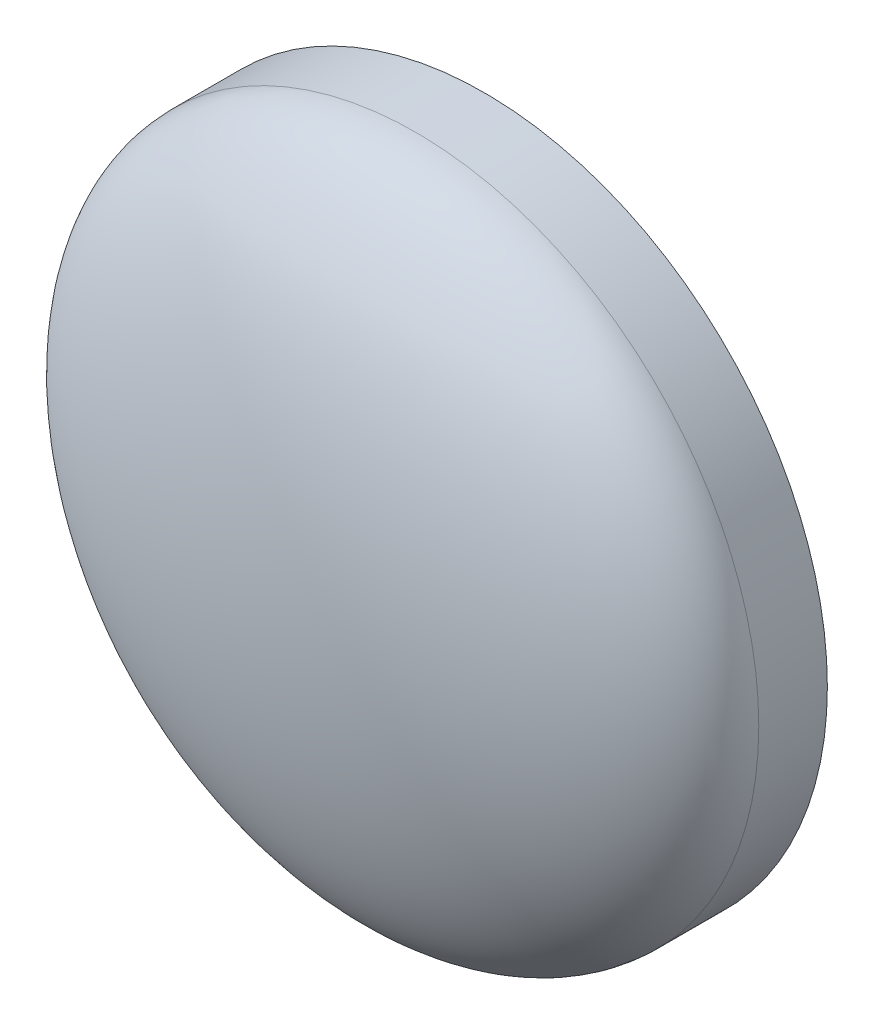
ISO-10303-21;
HEADER;
FILE_DESCRIPTION(('STEP AP214'),'2;1');
FILE_NAME('part.step','',(''),(''),'','','');
FILE_SCHEMA(('AUTOMOTIVE_DESIGN { 1 0 10303 214 1 1 1 1 }'));
ENDSEC;
DATA;
#1=APPLICATION_CONTEXT('core data for automotive mechanical design processes');
#2=APPLICATION_PROTOCOL_DEFINITION('international standard','automotive_design',2000,#1);
#3=PRODUCT_CONTEXT('',#1,'mechanical');
#4=PRODUCT('Part','Part','',(#3));
#5=PRODUCT_RELATED_PRODUCT_CATEGORY('part','',(#4));
#6=PRODUCT_DEFINITION_FORMATION('','',#4);
#7=PRODUCT_DEFINITION_CONTEXT('part definition',#1,'design');
#8=PRODUCT_DEFINITION('design','',#6,#7);
#9=PRODUCT_DEFINITION_SHAPE('','',#8);
#10=(LENGTH_UNIT() NAMED_UNIT(*) SI_UNIT(.MILLI.,.METRE.));
#11=(NAMED_UNIT(*) PLANE_ANGLE_UNIT() SI_UNIT($,.RADIAN.));
#12=(NAMED_UNIT(*) SI_UNIT($,.STERADIAN.) SOLID_ANGLE_UNIT());
#13=UNCERTAINTY_MEASURE_WITH_UNIT(LENGTH_MEASURE(1.E-05),#10,'distance_accuracy_value','');
#14=(GEOMETRIC_REPRESENTATION_CONTEXT(3) GLOBAL_UNCERTAINTY_ASSIGNED_CONTEXT((#13)) GLOBAL_UNIT_ASSIGNED_CONTEXT((#10,
#11,#12)) REPRESENTATION_CONTEXT('',''));
#15=CARTESIAN_POINT('',(0.,0.,0.));
#16=DIRECTION('',(0.,0.,1.));
#17=DIRECTION('',(1.,0.,0.));
#18=AXIS2_PLACEMENT_3D('',#15,#16,#17);
#19=CARTESIAN_POINT('',(0.,0.,5.));
#20=DIRECTION('',(0.,0.,-1.));
#21=DIRECTION('',(-1.,0.,0.));
#22=AXIS2_PLACEMENT_3D('',#19,#20,#21);
#23=CYLINDRICAL_SURFACE('',#22,25.);
#24=CARTESIAN_POINT('',(0.,0.,5.));
#25=DIRECTION('',(0.,0.,1.));
#26=DIRECTION('',(1.,0.,0.));
#27=AXIS2_PLACEMENT_3D('',#24,#25,#26);
#28=CIRCLE('',#27,25.);
#29=CARTESIAN_POINT('',(25.,0.,5.));
#30=VERTEX_POINT('',#29);
#31=EDGE_CURVE('E11',#30,#30,#28,.T.);
#32=ORIENTED_EDGE('',*,*,#31,.F.);
#33=EDGE_LOOP('',(#32));
#34=FACE_BOUND('',#33,.T.);
#35=CARTESIAN_POINT('',(0.,0.,0.));
#36=DIRECTION('',(0.,0.,1.));
#37=DIRECTION('',(1.,0.,0.));
#38=AXIS2_PLACEMENT_3D('',#35,#36,#37);
#39=CIRCLE('',#38,25.);
#40=CARTESIAN_POINT('',(25.,0.,0.));
#41=VERTEX_POINT('',#40);
#42=EDGE_CURVE('E42',#41,#41,#39,.T.);
#43=ORIENTED_EDGE('',*,*,#42,.T.);
#44=EDGE_LOOP('',(#43));
#45=FACE_BOUND('',#44,.T.);
#46=ADVANCED_FACE('F33',(#34,#45),#23,.T.);
#47=CARTESIAN_POINT('',(0.,0.,5.));
#48=DIRECTION('',(0.,1.,0.));
#49=DIRECTION('',(1.,0.,0.));
#50=AXIS2_PLACEMENT_3D('',#47,#48,#49);
#51=ELLIPSE('',#50,25.,10.);
#52=TRIMMED_CURVE('',#51,(PARAMETER_VALUE(4.71238898038469)),
(PARAMETER_VALUE(7.85398163397448)),.T.,.PARAMETER.);
#53=CARTESIAN_POINT('',(0.,0.,-5.));
#54=DIRECTION('',(0.,0.,1.));
#55=AXIS1_PLACEMENT('',#53,#54);
#56=SURFACE_OF_REVOLUTION('',#52,#55);
#57=CARTESIAN_POINT('',(0.,0.,15.));
#58=VERTEX_POINT('',#57);
#59=VERTEX_LOOP('',#58);
#60=FACE_BOUND('',#59,.T.);
#61=ORIENTED_EDGE('',*,*,#31,.T.);
#62=EDGE_LOOP('',(#61));
#63=FACE_BOUND('',#62,.T.);
#64=ADVANCED_FACE('F35',(#60,#63),#56,.F.);
#65=CARTESIAN_POINT('',(0.,0.,0.));
#66=DIRECTION('',(0.,0.,1.));
#67=DIRECTION('',(1.,0.,0.));
#68=AXIS2_PLACEMENT_3D('',#65,#66,#67);
#69=PLANE('',#68);
#70=CARTESIAN_POINT('',(0.,0.,0.));
#71=DIRECTION('',(0.,0.,-1.));
#72=DIRECTION('',(-1.,0.,0.));
#73=AXIS2_PLACEMENT_3D('',#70,#71,#72);
#74=CIRCLE('',#73,15.0256020434714);
#75=CARTESIAN_POINT('',(12.2086109473925,-8.75891177624141,0.));
#76=VERTEX_POINT('',#75);
#77=CARTESIAN_POINT('',(14.6201348503318,-3.46704106218611,0.));
#78=VERTEX_POINT('',#77);
#79=EDGE_CURVE('E138',#76,#78,#74,.T.);
#80=ORIENTED_EDGE('',*,*,#79,.F.);
#81=CARTESIAN_POINT('',(11.8023506553898,-8.46744552580763,0.));
#82=DIRECTION('',(0.,0.,-1.));
#83=DIRECTION('',(-1.,0.,0.));
#84=AXIS2_PLACEMENT_3D('',#81,#82,#83);
#85=CIRCLE('',#84,0.500000000000001);
#86=CARTESIAN_POINT('',(12.0095901442129,-8.01241608250494,0.));
#87=VERTEX_POINT('',#86);
#88=EDGE_CURVE('E52',#87,#76,#85,.T.);
#89=ORIENTED_EDGE('',*,*,#88,.F.);
#90=DIRECTION('',(-0.910058886605393,0.414478977646094,0.));
#91=VECTOR('',#90,1.);
#92=CARTESIAN_POINT('',(12.0095901442129,-8.01241608250494,0.));
#93=LINE('',#92,#91);
#94=CARTESIAN_POINT('',(11.0567943159302,-7.57847290956904,0.));
#95=VERTEX_POINT('',#94);
#96=EDGE_CURVE('E119',#87,#95,#93,.T.);
#97=ORIENTED_EDGE('',*,*,#96,.T.);
#98=CARTESIAN_POINT('',(10.8495548271072,-8.03350235287174,0.));
#99=DIRECTION('',(0.,0.,-1.));
#100=DIRECTION('',(-1.,0.,0.));
#101=AXIS2_PLACEMENT_3D('',#98,#99,#100);
#102=CIRCLE('',#101,0.499999999999999);
#103=CARTESIAN_POINT('',(10.4477194631402,-7.73596522869131,0.));
#104=VERTEX_POINT('',#103);
#105=EDGE_CURVE('E122',#104,#95,#102,.T.);
#106=ORIENTED_EDGE('',*,*,#105,.F.);
#107=CARTESIAN_POINT('',(0.,0.,0.));
#108=DIRECTION('',(0.,0.,1.));
#109=DIRECTION('',(1.,0.,0.));
#110=AXIS2_PLACEMENT_3D('',#107,#108,#109);
#111=CIRCLE('',#110,13.);
#112=CARTESIAN_POINT('',(12.6927240734143,-2.80976077205326,0.));
#113=VERTEX_POINT('',#112);
#114=EDGE_CURVE('E149',#113,#104,#111,.T.);
#115=ORIENTED_EDGE('',*,*,#114,.F.);
#116=CARTESIAN_POINT('',(13.1809057685456,-2.91782849405531,0.));
#117=DIRECTION('',(0.,0.,1.));
#118=DIRECTION('',(1.,0.,0.));
#119=AXIS2_PLACEMENT_3D('',#116,#117,#118);
#120=CIRCLE('',#119,0.5);
#121=CARTESIAN_POINT('',(12.9736931510126,-3.37287017471228,0.));
#122=VERTEX_POINT('',#121);
#123=EDGE_CURVE('E146',#113,#122,#120,.T.);
#124=ORIENTED_EDGE('',*,*,#123,.T.);
#125=DIRECTION('',(-0.910083361313928,0.41442523506604,0.));
#126=VECTOR('',#125,1.);
#127=CARTESIAN_POINT('',(13.9264147767903,-3.80671162319824,0.));
#128=LINE('',#127,#126);
#129=CARTESIAN_POINT('',(13.9264147767903,-3.80671162319824,0.));
#130=VERTEX_POINT('',#129);
#131=EDGE_CURVE('E143',#130,#122,#128,.T.);
#132=ORIENTED_EDGE('',*,*,#131,.F.);
#133=CARTESIAN_POINT('',(14.1336273943233,-3.35166994254127,0.));
#134=DIRECTION('',(0.,0.,1.));
#135=DIRECTION('',(1.,0.,0.));
#136=AXIS2_PLACEMENT_3D('',#133,#134,#135);
#137=CIRCLE('',#136,0.500000000000001);
#138=EDGE_CURVE('E140',#130,#78,#137,.T.);
#139=ORIENTED_EDGE('',*,*,#138,.T.);
#140=EDGE_LOOP('',(#80,#89,#97,#106,#115,#124,#132,#139));
#141=FACE_BOUND('',#140,.T.);
#142=ORIENTED_EDGE('',*,*,#42,.F.);
#143=EDGE_LOOP('',(#142));
#144=FACE_BOUND('',#143,.T.);
#145=ADVANCED_FACE('F171',(#141,#144),#69,.F.);
#146=CARTESIAN_POINT('',(11.8023506553898,-8.46744552580763,3.));
#147=DIRECTION('',(0.,0.,-1.));
#148=DIRECTION('',(-1.,0.,0.));
#149=AXIS2_PLACEMENT_3D('',#146,#147,#148);
#150=CYLINDRICAL_SURFACE('',#149,0.500000000000001);
#151=ORIENTED_EDGE('',*,*,#88,.T.);
#152=DIRECTION('',(0.,0.,-1.));
#153=VECTOR('',#152,1.);
#154=CARTESIAN_POINT('',(12.2086109473925,-8.75891177624141,3.));
#155=LINE('',#154,#153);
#156=CARTESIAN_POINT('',(12.2086109473925,-8.75891177624141,3.));
#157=VERTEX_POINT('',#156);
#158=EDGE_CURVE('E97',#157,#76,#155,.T.);
#159=ORIENTED_EDGE('',*,*,#158,.F.);
#160=CARTESIAN_POINT('',(11.8023506553898,-8.46744552580763,3.));
#161=DIRECTION('',(0.,0.,-1.));
#162=DIRECTION('',(-1.,0.,0.));
#163=AXIS2_PLACEMENT_3D('',#160,#161,#162);
#164=CIRCLE('',#163,0.500000000000001);
#165=CARTESIAN_POINT('',(12.0095901442129,-8.01241608250494,3.));
#166=VERTEX_POINT('',#165);
#167=EDGE_CURVE('E101',#166,#157,#164,.T.);
#168=ORIENTED_EDGE('',*,*,#167,.F.);
#169=DIRECTION('',(0.,0.,-1.));
#170=VECTOR('',#169,1.);
#171=CARTESIAN_POINT('',(12.0095901442129,-8.01241608250494,3.));
#172=LINE('',#171,#170);
#173=EDGE_CURVE('E154',#166,#87,#172,.T.);
#174=ORIENTED_EDGE('',*,*,#173,.T.);
#175=EDGE_LOOP('',(#151,#159,#168,#174));
#176=FACE_BOUND('',#175,.T.);
#177=ADVANCED_FACE('F99',(#176),#150,.F.);
#178=CARTESIAN_POINT('',(12.0095901442129,-8.01241608250494,3.));
#179=DIRECTION('',(-0.414478977646094,-0.910058886605393,0.));
#180=DIRECTION('',(0.910058886605394,-0.414478977646095,0.));
#181=AXIS2_PLACEMENT_3D('',#178,#179,#180);
#182=PLANE('',#181);
#183=ORIENTED_EDGE('',*,*,#96,.F.);
#184=ORIENTED_EDGE('',*,*,#173,.F.);
#185=DIRECTION('',(-0.910058886605393,0.414478977646094,0.));
#186=VECTOR('',#185,1.);
#187=CARTESIAN_POINT('',(12.0095901442129,-8.01241608250494,3.));
#188=LINE('',#187,#186);
#189=CARTESIAN_POINT('',(11.0567943159302,-7.57847290956904,3.));
#190=VERTEX_POINT('',#189);
#191=EDGE_CURVE('E106',#166,#190,#188,.T.);
#192=ORIENTED_EDGE('',*,*,#191,.T.);
#193=DIRECTION('',(0.,0.,-1.));
#194=VECTOR('',#193,1.);
#195=CARTESIAN_POINT('',(11.0567943159302,-7.57847290956904,3.));
#196=LINE('',#195,#194);
#197=EDGE_CURVE('E156',#190,#95,#196,.T.);
#198=ORIENTED_EDGE('',*,*,#197,.T.);
#199=EDGE_LOOP('',(#183,#184,#192,#198));
#200=FACE_BOUND('',#199,.T.);
#201=ADVANCED_FACE('F179',(#200),#182,.T.);
#202=CARTESIAN_POINT('',(10.8495548271072,-8.03350235287174,3.));
#203=DIRECTION('',(0.,0.,-1.));
#204=DIRECTION('',(-1.,0.,0.));
#205=AXIS2_PLACEMENT_3D('',#202,#203,#204);
#206=CYLINDRICAL_SURFACE('',#205,0.499999999999999);
#207=ORIENTED_EDGE('',*,*,#105,.T.);
#208=ORIENTED_EDGE('',*,*,#197,.F.);
#209=CARTESIAN_POINT('',(10.8495548271072,-8.03350235287174,3.));
#210=DIRECTION('',(0.,0.,-1.));
#211=DIRECTION('',(-1.,0.,0.));
#212=AXIS2_PLACEMENT_3D('',#209,#210,#211);
#213=CIRCLE('',#212,0.499999999999999);
#214=CARTESIAN_POINT('',(10.4477194631402,-7.73596522869131,3.));
#215=VERTEX_POINT('',#214);
#216=EDGE_CURVE('E134',#215,#190,#213,.T.);
#217=ORIENTED_EDGE('',*,*,#216,.F.);
#218=DIRECTION('',(0.,0.,-1.));
#219=VECTOR('',#218,1.);
#220=CARTESIAN_POINT('',(10.4477194631402,-7.73596522869131,3.));
#221=LINE('',#220,#219);
#222=EDGE_CURVE('E158',#215,#104,#221,.T.);
#223=ORIENTED_EDGE('',*,*,#222,.T.);
#224=EDGE_LOOP('',(#207,#208,#217,#223));
#225=FACE_BOUND('',#224,.T.);
#226=ADVANCED_FACE('F243',(#225),#206,.F.);
#227=CARTESIAN_POINT('',(0.,0.,3.));
#228=DIRECTION('',(0.,0.,-1.));
#229=DIRECTION('',(-1.,0.,0.));
#230=AXIS2_PLACEMENT_3D('',#227,#228,#229);
#231=CYLINDRICAL_SURFACE('',#230,13.);
#232=ORIENTED_EDGE('',*,*,#114,.T.);
#233=ORIENTED_EDGE('',*,*,#222,.F.);
#234=CARTESIAN_POINT('',(0.,0.,3.));
#235=DIRECTION('',(0.,0.,1.));
#236=DIRECTION('',(1.,0.,0.));
#237=AXIS2_PLACEMENT_3D('',#234,#235,#236);
#238=CIRCLE('',#237,13.);
#239=CARTESIAN_POINT('',(12.6927240734143,-2.80976077205326,3.));
#240=VERTEX_POINT('',#239);
#241=EDGE_CURVE('E131',#240,#215,#238,.T.);
#242=ORIENTED_EDGE('',*,*,#241,.F.);
#243=DIRECTION('',(0.,0.,-1.));
#244=VECTOR('',#243,1.);
#245=CARTESIAN_POINT('',(12.6927240734143,-2.80976077205326,3.));
#246=LINE('',#245,#244);
#247=EDGE_CURVE('E160',#240,#113,#246,.T.);
#248=ORIENTED_EDGE('',*,*,#247,.T.);
#249=EDGE_LOOP('',(#232,#233,#242,#248));
#250=FACE_BOUND('',#249,.T.);
#251=ADVANCED_FACE('F234',(#250),#231,.T.);
#252=CARTESIAN_POINT('',(13.1809057685456,-2.91782849405531,3.));
#253=DIRECTION('',(0.,0.,-1.));
#254=DIRECTION('',(-1.,0.,0.));
#255=AXIS2_PLACEMENT_3D('',#252,#253,#254);
#256=CYLINDRICAL_SURFACE('',#255,0.5);
#257=ORIENTED_EDGE('',*,*,#123,.F.);
#258=ORIENTED_EDGE('',*,*,#247,.F.);
#259=CARTESIAN_POINT('',(13.1809057685456,-2.91782849405531,3.));
#260=DIRECTION('',(0.,0.,1.));
#261=DIRECTION('',(1.,0.,0.));
#262=AXIS2_PLACEMENT_3D('',#259,#260,#261);
#263=CIRCLE('',#262,0.5);
#264=CARTESIAN_POINT('',(12.9736931510126,-3.37287017471228,3.));
#265=VERTEX_POINT('',#264);
#266=EDGE_CURVE('E129',#240,#265,#263,.T.);
#267=ORIENTED_EDGE('',*,*,#266,.T.);
#268=DIRECTION('',(0.,0.,-1.));
#269=VECTOR('',#268,1.);
#270=CARTESIAN_POINT('',(12.9736931510126,-3.37287017471228,3.));
#271=LINE('',#270,#269);
#272=EDGE_CURVE('E162',#265,#122,#271,.T.);
#273=ORIENTED_EDGE('',*,*,#272,.T.);
#274=EDGE_LOOP('',(#257,#258,#267,#273));
#275=FACE_BOUND('',#274,.T.);
#276=ADVANCED_FACE('F225',(#275),#256,.F.);
#277=CARTESIAN_POINT('',(13.9264147767903,-3.80671162319824,3.));
#278=DIRECTION('',(-0.41442523506604,-0.910083361313928,0.));
#279=DIRECTION('',(0.910083361313928,-0.41442523506604,0.));
#280=AXIS2_PLACEMENT_3D('',#277,#278,#279);
#281=PLANE('',#280);
#282=ORIENTED_EDGE('',*,*,#131,.T.);
#283=ORIENTED_EDGE('',*,*,#272,.F.);
#284=DIRECTION('',(-0.910083361313928,0.41442523506604,0.));
#285=VECTOR('',#284,1.);
#286=CARTESIAN_POINT('',(13.9264147767903,-3.80671162319824,3.));
#287=LINE('',#286,#285);
#288=CARTESIAN_POINT('',(13.9264147767903,-3.80671162319824,3.));
#289=VERTEX_POINT('',#288);
#290=EDGE_CURVE('E126',#289,#265,#287,.T.);
#291=ORIENTED_EDGE('',*,*,#290,.F.);
#292=DIRECTION('',(0.,0.,-1.));
#293=VECTOR('',#292,1.);
#294=CARTESIAN_POINT('',(13.9264147767903,-3.80671162319824,3.));
#295=LINE('',#294,#293);
#296=EDGE_CURVE('E164',#289,#130,#295,.T.);
#297=ORIENTED_EDGE('',*,*,#296,.T.);
#298=EDGE_LOOP('',(#282,#283,#291,#297));
#299=FACE_BOUND('',#298,.T.);
#300=ADVANCED_FACE('F216',(#299),#281,.F.);
#301=CARTESIAN_POINT('',(14.1336273943233,-3.35166994254127,3.));
#302=DIRECTION('',(0.,0.,-1.));
#303=DIRECTION('',(-1.,0.,0.));
#304=AXIS2_PLACEMENT_3D('',#301,#302,#303);
#305=CYLINDRICAL_SURFACE('',#304,0.500000000000001);
#306=ORIENTED_EDGE('',*,*,#138,.F.);
#307=ORIENTED_EDGE('',*,*,#296,.F.);
#308=CARTESIAN_POINT('',(14.1336273943233,-3.35166994254127,3.));
#309=DIRECTION('',(0.,0.,1.));
#310=DIRECTION('',(1.,0.,0.));
#311=AXIS2_PLACEMENT_3D('',#308,#309,#310);
#312=CIRCLE('',#311,0.500000000000001);
#313=CARTESIAN_POINT('',(14.6201348503318,-3.46704106218611,3.));
#314=VERTEX_POINT('',#313);
#315=EDGE_CURVE('E114',#289,#314,#312,.T.);
#316=ORIENTED_EDGE('',*,*,#315,.T.);
#317=DIRECTION('',(0.,0.,-1.));
#318=VECTOR('',#317,1.);
#319=CARTESIAN_POINT('',(14.6201348503318,-3.46704106218611,3.));
#320=LINE('',#319,#318);
#321=EDGE_CURVE('E105',#314,#78,#320,.T.);
#322=ORIENTED_EDGE('',*,*,#321,.T.);
#323=EDGE_LOOP('',(#306,#307,#316,#322));
#324=FACE_BOUND('',#323,.T.);
#325=ADVANCED_FACE('F208',(#324),#305,.F.);
#326=CARTESIAN_POINT('',(0.,0.,3.));
#327=DIRECTION('',(0.,0.,-1.));
#328=DIRECTION('',(-1.,0.,0.));
#329=AXIS2_PLACEMENT_3D('',#326,#327,#328);
#330=CYLINDRICAL_SURFACE('',#329,15.0256020434714);
#331=ORIENTED_EDGE('',*,*,#79,.T.);
#332=ORIENTED_EDGE('',*,*,#321,.F.);
#333=CARTESIAN_POINT('',(0.,0.,3.));
#334=DIRECTION('',(0.,0.,-1.));
#335=DIRECTION('',(-1.,0.,0.));
#336=AXIS2_PLACEMENT_3D('',#333,#334,#335);
#337=CIRCLE('',#336,15.0256020434714);
#338=EDGE_CURVE('E110',#157,#314,#337,.T.);
#339=ORIENTED_EDGE('',*,*,#338,.F.);
#340=ORIENTED_EDGE('',*,*,#158,.T.);
#341=EDGE_LOOP('',(#331,#332,#339,#340));
#342=FACE_BOUND('',#341,.T.);
#343=ADVANCED_FACE('F111',(#342),#330,.F.);
#344=CARTESIAN_POINT('',(11.8023506553898,-8.46744552580763,3.));
#345=DIRECTION('',(0.,0.,-1.));
#346=DIRECTION('',(-1.,0.,0.));
#347=AXIS2_PLACEMENT_3D('',#344,#345,#346);
#348=PLANE('',#347);
#349=ORIENTED_EDGE('',*,*,#167,.T.);
#350=ORIENTED_EDGE('',*,*,#338,.T.);
#351=ORIENTED_EDGE('',*,*,#315,.F.);
#352=ORIENTED_EDGE('',*,*,#290,.T.);
#353=ORIENTED_EDGE('',*,*,#266,.F.);
#354=ORIENTED_EDGE('',*,*,#241,.T.);
#355=ORIENTED_EDGE('',*,*,#216,.T.);
#356=ORIENTED_EDGE('',*,*,#191,.F.);
#357=EDGE_LOOP('',(#349,#350,#351,#352,#353,#354,#355,#356));
#358=FACE_BOUND('',#357,.T.);
#359=ADVANCED_FACE('F117',(#358),#348,.T.);
#360=CLOSED_SHELL('',(#46,#64,#145,#177,#201,#226,#251,#276,#300,#325,#343,#359));
#361=MANIFOLD_SOLID_BREP('B2',#360);
#362=ADVANCED_BREP_SHAPE_REPRESENTATION('',(#18,#361),#14);
#363=SHAPE_DEFINITION_REPRESENTATION(#9,#362);
ENDSEC;
END-ISO-10303-21;
